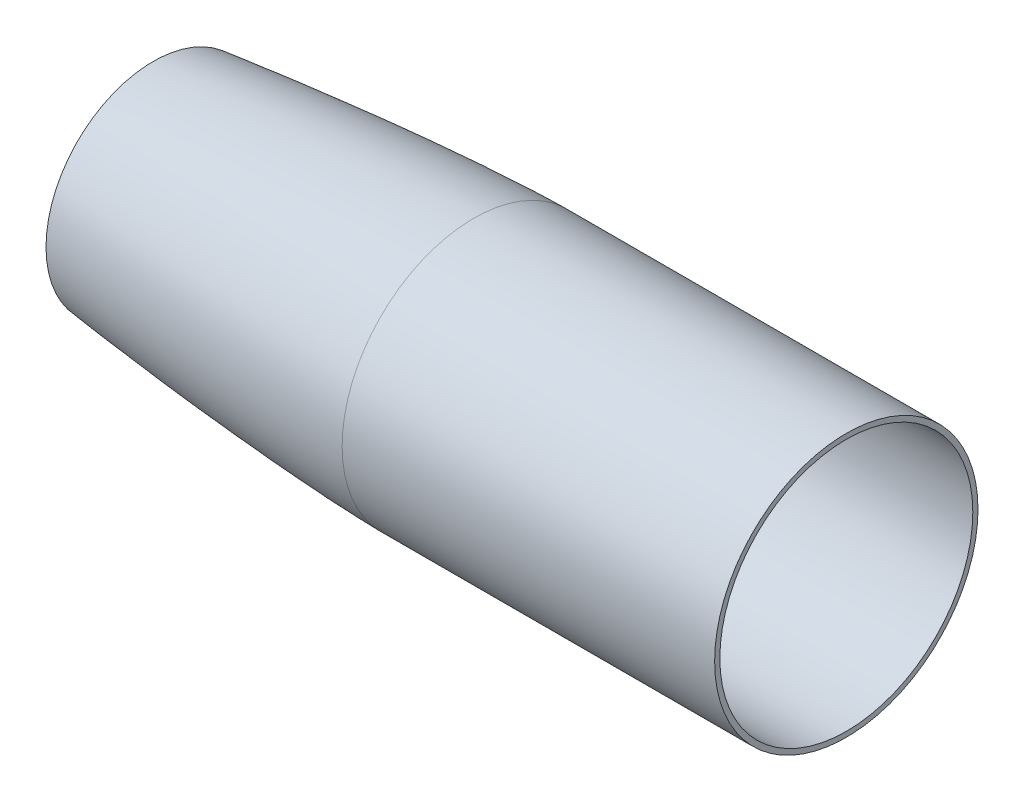
ISO-10303-21;
HEADER;
FILE_DESCRIPTION(('STEP AP214'),'2;1');
FILE_NAME('part.step','',(''),(''),'','','');
FILE_SCHEMA(('AUTOMOTIVE_DESIGN { 1 0 10303 214 1 1 1 1 }'));
ENDSEC;
DATA;
#1=APPLICATION_CONTEXT('core data for automotive mechanical design processes');
#2=APPLICATION_PROTOCOL_DEFINITION('international standard','automotive_design',2000,#1);
#3=PRODUCT_CONTEXT('',#1,'mechanical');
#4=PRODUCT('Part','Part','',(#3));
#5=PRODUCT_RELATED_PRODUCT_CATEGORY('part','',(#4));
#6=PRODUCT_DEFINITION_FORMATION('','',#4);
#7=PRODUCT_DEFINITION_CONTEXT('part definition',#1,'design');
#8=PRODUCT_DEFINITION('design','',#6,#7);
#9=PRODUCT_DEFINITION_SHAPE('','',#8);
#10=(LENGTH_UNIT() NAMED_UNIT(*) SI_UNIT(.MILLI.,.METRE.));
#11=(NAMED_UNIT(*) PLANE_ANGLE_UNIT() SI_UNIT($,.RADIAN.));
#12=(NAMED_UNIT(*) SI_UNIT($,.STERADIAN.) SOLID_ANGLE_UNIT());
#13=UNCERTAINTY_MEASURE_WITH_UNIT(LENGTH_MEASURE(1.E-05),#10,'distance_accuracy_value','');
#14=(GEOMETRIC_REPRESENTATION_CONTEXT(3) GLOBAL_UNCERTAINTY_ASSIGNED_CONTEXT((#13)) GLOBAL_UNIT_ASSIGNED_CONTEXT((#10,
#11,#12)) REPRESENTATION_CONTEXT('',''));
#15=CARTESIAN_POINT('',(0.,0.,0.));
#16=DIRECTION('',(0.,0.,1.));
#17=DIRECTION('',(1.,0.,0.));
#18=AXIS2_PLACEMENT_3D('',#15,#16,#17);
#19=CARTESIAN_POINT('',(2.46242861657696,-1.71360593727464,0.));
#20=CARTESIAN_POINT('',(2.54240538542814,-1.64935223590772,0.));
#21=CARTESIAN_POINT('',(2.69326586757068,-1.5376167890547,0.));
#22=CARTESIAN_POINT('',(3.12116375508338,-1.24894611789659,0.));
#23=CARTESIAN_POINT('',(3.71792613307507,-0.890584151750187,0.));
#24=CARTESIAN_POINT('',(4.46523928682722,-0.481358356929767,0.));
#25=CARTESIAN_POINT('',(5.10757263701104,-0.152579044963429,0.));
#26=CARTESIAN_POINT('',(5.93779320245599,0.256164080251996,0.));
#27=CARTESIAN_POINT('',(7.10914975908798,0.801724321006968,0.));
#28=CARTESIAN_POINT('',(9.33297720926114,1.76637776056329,0.));
#29=CARTESIAN_POINT('',(12.3238588046822,2.95068577360916,0.));
#30=CARTESIAN_POINT('',(15.9792590372244,4.28413730807516,0.));
#31=CARTESIAN_POINT('',(19.6752374118746,5.54742893146461,0.));
#32=CARTESIAN_POINT('',(24.6446608517255,7.15925181480253,0.));
#33=CARTESIAN_POINT('',(30.9085090694989,9.06037602227893,0.));
#34=CARTESIAN_POINT('',(38.4818172119859,11.2071016462648,0.));
#35=CARTESIAN_POINT('',(48.6307285915987,13.9277448022632,0.));
#36=CARTESIAN_POINT('',(61.3907944693883,17.1092489065383,0.));
#37=CARTESIAN_POINT('',(76.7776827493255,20.6701506616642,0.));
#38=CARTESIAN_POINT('',(92.2195760098601,24.0232674050828,0.));
#39=CARTESIAN_POINT('',(107.703561132301,27.2040131478384,0.));
#40=CARTESIAN_POINT('',(128.394086794942,31.2449208783169,0.));
#41=CARTESIAN_POINT('',(154.327525341589,35.9654087953275,0.));
#42=CARTESIAN_POINT('',(185.530660987719,41.1907345829725,0.));
#43=CARTESIAN_POINT('',(216.800212994177,46.0287501728444,0.));
#44=CARTESIAN_POINT('',(258.566646099506,52.0058917634354,0.));
#45=CARTESIAN_POINT('',(310.892971561743,58.6394584332236,0.));
#46=CARTESIAN_POINT('',(363.34454375986,64.1826058617841,0.));
#47=CARTESIAN_POINT('',(405.368729998461,67.8843796406401,0.));
#48=CARTESIAN_POINT('',(431.657472472553,69.8521944609255,0.));
#49=CARTESIAN_POINT('',(452.699458369267,71.1743291893432,0.));
#50=CARTESIAN_POINT('',(468.485172815139,72.01835718208,0.));
#51=CARTESIAN_POINT('',(481.638890805244,72.572899611088,0.));
#52=CARTESIAN_POINT('',(490.843500267024,72.8482467093124,0.));
#53=CARTESIAN_POINT('',(495.435669889452,72.9472502541124,0.));
#54=CARTESIAN_POINT('',(498.06197157869,72.9850308325065,0.));
#55=CARTESIAN_POINT('',(499.352045650523,73.,0.));
#56=CARTESIAN_POINT('',(500.,73.,0.));
#57=B_SPLINE_CURVE_WITH_KNOTS('',3,(#19,#20,#21,#22,#23,#24,#25,#26,#27,#28,#29,#30,#31,#32,#33,
#34,#35,#36,#37,#38,#39,#40,#41,#42,#43,#44,#45,#46,#47,#48,#49,#50,#51,#52,#53,#54,#55,#56),
.UNSPECIFIED.,.F.,.F.,(4,1,1,1,1,1,1,1,1,1,1,1,1,1,1,1,1,1,1,1,1,1,1,1,1,1,1,1,1,1,1,1,1,1,1,4),
(0.00170018691780236,0.00267508907901544,0.00364999124022853,0.0055997955626547,
0.00754959988508086,0.00924732815472119,0.0102222303159343,0.0133990128523594,
0.0172986214972117,0.0250978387869164,0.032897056076621,0.0406962733663257,0.0484954906560304,
0.0640939252354397,0.0796923598148491,0.0952907943942584,0.126487663553077,0.157684532711896,
0.188881401870714,0.220078271029533,0.251275140188352,0.313668878505989,0.376062616823627,
0.438456355141264,0.500850093458901,0.625637570094176,0.750425046729451,0.812818785047088,
0.875212523364725,0.906409392523544,0.937606261682363,0.968803130841181,0.984401565420591,
0.992200782710295,0.996100391355148,1.),.UNSPECIFIED.);
#58=CARTESIAN_POINT('',(0.,0.,0.));
#59=DIRECTION('',(-1.,0.,0.));
#60=AXIS1_PLACEMENT('',#58,#59);
#61=SURFACE_OF_REVOLUTION('',#57,#60);
#62=CARTESIAN_POINT('',(500.,0.,0.));
#63=DIRECTION('',(-1.,0.,0.));
#64=DIRECTION('',(0.,0.,1.));
#65=AXIS2_PLACEMENT_3D('',#62,#63,#64);
#66=CIRCLE('',#65,73.);
#67=CARTESIAN_POINT('',(500.,0.,73.));
#68=VERTEX_POINT('',#67);
#69=EDGE_CURVE('E10',#68,#68,#66,.T.);
#70=ORIENTED_EDGE('',*,*,#69,.F.);
#71=EDGE_LOOP('',(#70));
#72=FACE_BOUND('',#71,.T.);
#73=CARTESIAN_POINT('',(315.,0.,0.));
#74=DIRECTION('',(-1.,0.,0.));
#75=DIRECTION('',(0.,0.,1.));
#76=AXIS2_PLACEMENT_3D('',#73,#74,#75);
#77=CIRCLE('',#76,58.8929581281501);
#78=CARTESIAN_POINT('',(315.,0.,58.8929581281501));
#79=VERTEX_POINT('',#78);
#80=EDGE_CURVE('E57',#79,#79,#77,.F.);
#81=ORIENTED_EDGE('',*,*,#80,.F.);
#82=EDGE_LOOP('',(#81));
#83=FACE_BOUND('',#82,.T.);
#84=ADVANCED_FACE('F43',(#72,#83),#61,.T.);
#85=CARTESIAN_POINT('',(0.,0.,0.));
#86=CARTESIAN_POINT('',(0.00348815708150506,0.0137838164740925,0.));
#87=CARTESIAN_POINT('',(0.013190509544349,0.040336030383544,0.));
#88=CARTESIAN_POINT('',(0.0420634552482185,0.0896193783403986,0.));
#89=CARTESIAN_POINT('',(0.103253354051169,0.174781235928545,0.));
#90=CARTESIAN_POINT('',(0.195655925163746,0.279068590720651,0.));
#91=CARTESIAN_POINT('',(0.312893359452064,0.394476748091274,0.));
#92=CARTESIAN_POINT('',(0.444471000774034,0.511330855445247,0.));
#93=CARTESIAN_POINT('',(0.626416713035186,0.661995475048639,0.));
#94=CARTESIAN_POINT('',(0.905417523507349,0.874340043040807,0.));
#95=CARTESIAN_POINT('',(1.39310301039433,1.21028834407038,0.));
#96=CARTESIAN_POINT('',(2.2714971789692,1.74793599332229,0.));
#97=CARTESIAN_POINT('',(3.8158825795273,2.58108843018774,0.));
#98=CARTESIAN_POINT('',(6.62984422899735,3.90773413631313,0.));
#99=CARTESIAN_POINT('',(11.7321798562479,5.99062653456906,0.));
#100=CARTESIAN_POINT('',(20.2155176698402,8.97478283845926,0.));
#101=CARTESIAN_POINT('',(31.7244890273764,12.4921164932699,0.));
#102=CARTESIAN_POINT('',(45.6067992876066,16.2811720859821,0.));
#103=CARTESIAN_POINT('',(64.6513713207138,21.0208608111265,0.));
#104=CARTESIAN_POINT('',(87.6583688981087,26.2066316623123,0.));
#105=CARTESIAN_POINT('',(114.722363421534,31.746320491612,0.));
#106=CARTESIAN_POINT('',(145.854010301491,37.5378964984534,0.));
#107=CARTESIAN_POINT('',(177.066921725601,42.8718072058485,0.));
#108=CARTESIAN_POINT('',(208.345145014488,47.8072342797152,0.));
#109=CARTESIAN_POINT('',(239.678124677574,52.3811910671817,0.));
#110=CARTESIAN_POINT('',(271.058803784997,56.6151535217922,0.));
#111=CARTESIAN_POINT('',(302.482154914176,60.5196800248683,0.));
#112=CARTESIAN_POINT('',(330.011833268379,63.648418257696,0.));
#113=CARTESIAN_POINT('',(353.6315931015,66.1189429498532,0.));
#114=CARTESIAN_POINT('',(373.329466342974,68.0301325804821,0.));
#115=CARTESIAN_POINT('',(389.096438559733,69.4667844433404,0.));
#116=CARTESIAN_POINT('',(404.871994610151,70.8061290179717,0.));
#117=CARTESIAN_POINT('',(418.683052252662,71.8869969930374,0.));
#118=CARTESIAN_POINT('',(430.526418849091,72.7426627687598,0.));
#119=CARTESIAN_POINT('',(440.3994416843,73.4044359722074,0.));
#120=CARTESIAN_POINT('',(448.299980016576,73.901071327989,0.));
#121=CARTESIAN_POINT('',(455.214817723787,74.3047755760113,0.));
#122=CARTESIAN_POINT('',(461.143160455543,74.6267795298638,0.));
#123=CARTESIAN_POINT('',(466.084350078192,74.8778015174816,0.));
#124=CARTESIAN_POINT('',(470.037846817328,75.0675779870557,0.));
#125=CARTESIAN_POINT('',(476.005510657441,75.3363036357499,0.));
#126=CARTESIAN_POINT('',(481.73653717415,75.563352259305,0.));
#127=CARTESIAN_POINT('',(487.230769758864,75.7480857214816,0.));
#128=CARTESIAN_POINT('',(492.488061524514,75.8846626039559,0.));
#129=CARTESIAN_POINT('',(495.116996281498,75.9403485228989,0.));
#130=CARTESIAN_POINT('',(497.370577280614,75.9780437968764,0.));
#131=CARTESIAN_POINT('',(498.873076170461,75.9935941175532,0.));
#132=CARTESIAN_POINT('',(499.624354133603,76.,0.));
#133=CARTESIAN_POINT('',(500.,76.,0.));
#134=B_SPLINE_CURVE_WITH_KNOTS('',4,(#85,#86,#87,#88,#89,#90,#91,#92,#93,#94,#95,#96,#97,#98,
#99,#100,#101,#102,#103,#104,#105,#106,#107,#108,#109,#110,#111,#112,#113,#114,#115,#116,#117,
#118,#119,#120,#121,#122,#123,#124,#125,#126,#127,#128,#129,#130,#131,#132,#133),.UNSPECIFIED.,
.F.,.F.,(5,1,1,1,1,1,1,1,1,1,1,1,1,1,1,1,1,1,1,1,1,1,1,1,1,1,1,1,1,1,1,1,1,1,1,1,1,1,1,1,1,1,1,
1,1,5),(0.,0.000111673062630076,0.000223346125260152,0.000446692250520304,0.000826683235703061,
0.00120667422088582,0.00151954992421425,0.00183242562754267,0.0026877896203818,
0.00396811963384161,0.00618344769063095,0.00994281232869323,0.0165070850460175,
0.0284683202746382,0.0495866333595542,0.0807722271290261,0.111303183902214,0.141834140675402,
0.204203934807264,0.266574069316943,0.328944260118331,0.391314419863145,0.453684462992774,
0.51605456776173,0.578424700722885,0.640794794781792,0.703164954855881,0.734350023220203,
0.765535091584526,0.796720055272376,0.827905018960225,0.859090157331689,0.874682726517421,
0.890275295703153,0.90586778674361,0.921460277784067,0.929256523304296,0.937052768824524,
0.944849014344753,0.952645259864981,0.976322629932491,0.982241972449368,0.988161314966245,
0.994080657483123,0.997040328741561,1.),.UNSPECIFIED.);
#135=CARTESIAN_POINT('',(0.,0.,0.));
#136=DIRECTION('',(-1.,0.,0.));
#137=AXIS1_PLACEMENT('',#135,#136);
#138=SURFACE_OF_REVOLUTION('',#134,#137);
#139=CARTESIAN_POINT('',(500.,0.,0.));
#140=DIRECTION('',(-1.,0.,0.));
#141=DIRECTION('',(0.,0.,1.));
#142=AXIS2_PLACEMENT_3D('',#139,#140,#141);
#143=CIRCLE('',#142,76.);
#144=CARTESIAN_POINT('',(500.,0.,76.));
#145=VERTEX_POINT('',#144);
#146=EDGE_CURVE('E52',#145,#145,#143,.T.);
#147=ORIENTED_EDGE('',*,*,#146,.T.);
#148=EDGE_LOOP('',(#147));
#149=FACE_BOUND('',#148,.T.);
#150=CARTESIAN_POINT('',(315.,0.,0.));
#151=DIRECTION('',(-1.,0.,0.));
#152=DIRECTION('',(0.,0.,1.));
#153=AXIS2_PLACEMENT_3D('',#150,#151,#152);
#154=CIRCLE('',#153,61.9125733192018);
#155=CARTESIAN_POINT('',(315.,0.,61.9125733192018));
#156=VERTEX_POINT('',#155);
#157=EDGE_CURVE('E47',#156,#156,#154,.F.);
#158=ORIENTED_EDGE('',*,*,#157,.T.);
#159=EDGE_LOOP('',(#158));
#160=FACE_BOUND('',#159,.T.);
#161=ADVANCED_FACE('F71',(#149,#160),#138,.F.);
#162=CARTESIAN_POINT('',(0.,0.,0.));
#163=DIRECTION('',(-1.,0.,0.));
#164=DIRECTION('',(0.,0.,1.));
#165=AXIS2_PLACEMENT_3D('',#162,#163,#164);
#166=CYLINDRICAL_SURFACE('',#165,73.);
#167=ORIENTED_EDGE('',*,*,#69,.T.);
#168=EDGE_LOOP('',(#167));
#169=FACE_BOUND('',#168,.T.);
#170=CARTESIAN_POINT('',(715.,0.,0.));
#171=DIRECTION('',(1.,0.,0.));
#172=DIRECTION('',(0.,0.,-1.));
#173=AXIS2_PLACEMENT_3D('',#170,#171,#172);
#174=CIRCLE('',#173,73.);
#175=CARTESIAN_POINT('',(715.,0.,-73.));
#176=VERTEX_POINT('',#175);
#177=EDGE_CURVE('E103',#176,#176,#174,.T.);
#178=ORIENTED_EDGE('',*,*,#177,.T.);
#179=EDGE_LOOP('',(#178));
#180=FACE_BOUND('',#179,.T.);
#181=ADVANCED_FACE('F75',(#169,#180),#166,.F.);
#182=CARTESIAN_POINT('',(0.,0.,0.));
#183=DIRECTION('',(-1.,0.,0.));
#184=DIRECTION('',(0.,0.,1.));
#185=AXIS2_PLACEMENT_3D('',#182,#183,#184);
#186=CYLINDRICAL_SURFACE('',#185,76.);
#187=ORIENTED_EDGE('',*,*,#146,.F.);
#188=EDGE_LOOP('',(#187));
#189=FACE_BOUND('',#188,.T.);
#190=CARTESIAN_POINT('',(715.,0.,0.));
#191=DIRECTION('',(1.,0.,0.));
#192=DIRECTION('',(0.,0.,-1.));
#193=AXIS2_PLACEMENT_3D('',#190,#191,#192);
#194=CIRCLE('',#193,76.);
#195=CARTESIAN_POINT('',(715.,0.,-76.));
#196=VERTEX_POINT('',#195);
#197=EDGE_CURVE('E98',#196,#196,#194,.T.);
#198=ORIENTED_EDGE('',*,*,#197,.F.);
#199=EDGE_LOOP('',(#198));
#200=FACE_BOUND('',#199,.T.);
#201=ADVANCED_FACE('F79',(#189,#200),#186,.T.);
#202=CARTESIAN_POINT('',(315.,0.,200.));
#203=DIRECTION('',(-1.,0.,0.));
#204=DIRECTION('',(0.,0.,1.));
#205=AXIS2_PLACEMENT_3D('',#202,#203,#204);
#206=PLANE('',#205);
#207=ORIENTED_EDGE('',*,*,#157,.F.);
#208=EDGE_LOOP('',(#207));
#209=FACE_BOUND('',#208,.T.);
#210=ORIENTED_EDGE('',*,*,#80,.T.);
#211=EDGE_LOOP('',(#210));
#212=FACE_BOUND('',#211,.T.);
#213=ADVANCED_FACE('F77',(#209,#212),#206,.T.);
#214=CARTESIAN_POINT('',(715.,0.,0.));
#215=DIRECTION('',(1.,0.,0.));
#216=DIRECTION('',(0.,0.,-1.));
#217=AXIS2_PLACEMENT_3D('',#214,#215,#216);
#218=PLANE('',#217);
#219=ORIENTED_EDGE('',*,*,#197,.T.);
#220=EDGE_LOOP('',(#219));
#221=FACE_BOUND('',#220,.T.);
#222=ORIENTED_EDGE('',*,*,#177,.F.);
#223=EDGE_LOOP('',(#222));
#224=FACE_BOUND('',#223,.T.);
#225=ADVANCED_FACE('F108',(#221,#224),#218,.T.);
#226=CLOSED_SHELL('',(#84,#161,#181,#201,#213,#225));
#227=MANIFOLD_SOLID_BREP('B2',#226);
#228=ADVANCED_BREP_SHAPE_REPRESENTATION('',(#18,#227),#14);
#229=SHAPE_DEFINITION_REPRESENTATION(#9,#228);
ENDSEC;
END-ISO-10303-21;
